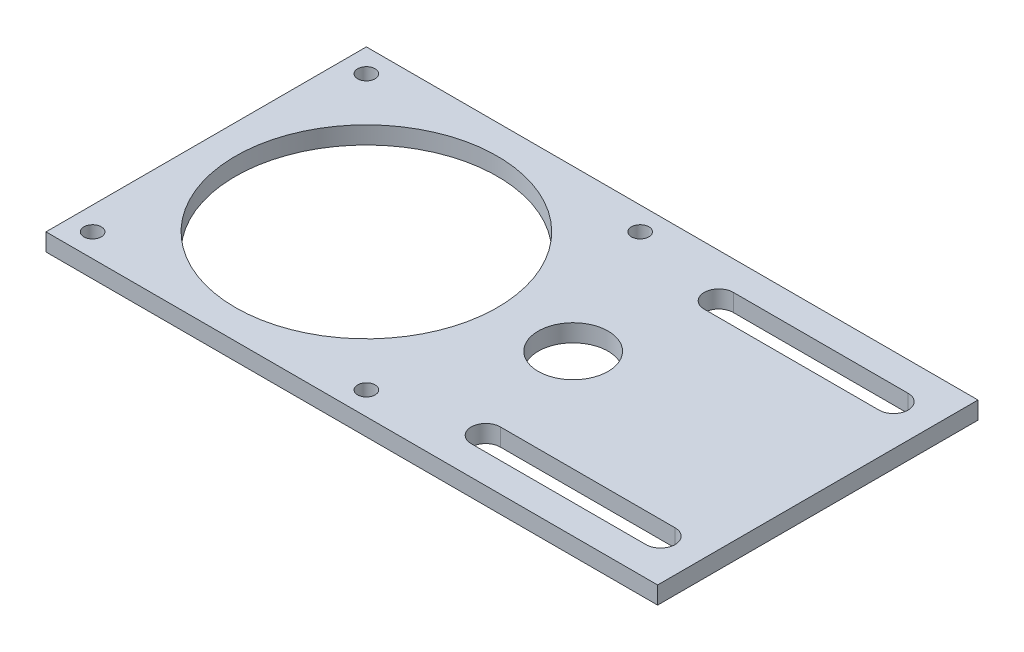
ISO-10303-21;
HEADER;
FILE_DESCRIPTION(('STEP AP214'),'2;1');
FILE_NAME('part.step','',(''),(''),'','','');
FILE_SCHEMA(('AUTOMOTIVE_DESIGN { 1 0 10303 214 1 1 1 1 }'));
ENDSEC;
DATA;
#1=APPLICATION_CONTEXT('core data for automotive mechanical design processes');
#2=APPLICATION_PROTOCOL_DEFINITION('international standard','automotive_design',2000,#1);
#3=PRODUCT_CONTEXT('',#1,'mechanical');
#4=PRODUCT('Part','Part','',(#3));
#5=PRODUCT_RELATED_PRODUCT_CATEGORY('part','',(#4));
#6=PRODUCT_DEFINITION_FORMATION('','',#4);
#7=PRODUCT_DEFINITION_CONTEXT('part definition',#1,'design');
#8=PRODUCT_DEFINITION('design','',#6,#7);
#9=PRODUCT_DEFINITION_SHAPE('','',#8);
#10=(LENGTH_UNIT() NAMED_UNIT(*) SI_UNIT(.MILLI.,.METRE.));
#11=(NAMED_UNIT(*) PLANE_ANGLE_UNIT() SI_UNIT($,.RADIAN.));
#12=(NAMED_UNIT(*) SI_UNIT($,.STERADIAN.) SOLID_ANGLE_UNIT());
#13=UNCERTAINTY_MEASURE_WITH_UNIT(LENGTH_MEASURE(1.E-05),#10,'distance_accuracy_value','');
#14=(GEOMETRIC_REPRESENTATION_CONTEXT(3) GLOBAL_UNCERTAINTY_ASSIGNED_CONTEXT((#13)) GLOBAL_UNIT_ASSIGNED_CONTEXT((#10,
#11,#12)) REPRESENTATION_CONTEXT('',''));
#15=CARTESIAN_POINT('',(0.,0.,0.));
#16=DIRECTION('',(0.,0.,1.));
#17=DIRECTION('',(1.,0.,0.));
#18=AXIS2_PLACEMENT_3D('',#15,#16,#17);
#19=CARTESIAN_POINT('',(0.,3.,0.));
#20=DIRECTION('',(0.,-1.,0.));
#21=DIRECTION('',(0.,0.,-1.));
#22=AXIS2_PLACEMENT_3D('',#19,#20,#21);
#23=PLANE('',#22);
#24=CARTESIAN_POINT('',(98.,3.,-47.5));
#25=DIRECTION('',(0.,1.,0.));
#26=DIRECTION('',(0.,0.,1.));
#27=AXIS2_PLACEMENT_3D('',#24,#25,#26);
#28=CIRCLE('',#27,2.50000000000001);
#29=CARTESIAN_POINT('',(98.,3.,-45.));
#30=VERTEX_POINT('',#29);
#31=CARTESIAN_POINT('',(98.,3.,-50.));
#32=VERTEX_POINT('',#31);
#33=EDGE_CURVE('E180',#30,#32,#28,.T.);
#34=ORIENTED_EDGE('',*,*,#33,.F.);
#35=DIRECTION('',(1.,0.,0.));
#36=VECTOR('',#35,1.);
#37=CARTESIAN_POINT('',(98.,3.,-45.));
#38=LINE('',#37,#36);
#39=CARTESIAN_POINT('',(68.,3.,-45.));
#40=VERTEX_POINT('',#39);
#41=EDGE_CURVE('E191',#40,#30,#38,.T.);
#42=ORIENTED_EDGE('',*,*,#41,.F.);
#43=CARTESIAN_POINT('',(68.,3.,-47.5));
#44=DIRECTION('',(0.,1.,0.));
#45=DIRECTION('',(0.,0.,1.));
#46=AXIS2_PLACEMENT_3D('',#43,#44,#45);
#47=CIRCLE('',#46,2.50000000000001);
#48=CARTESIAN_POINT('',(68.,3.,-50.));
#49=VERTEX_POINT('',#48);
#50=EDGE_CURVE('E187',#49,#40,#47,.T.);
#51=ORIENTED_EDGE('',*,*,#50,.F.);
#52=DIRECTION('',(-1.,0.,0.));
#53=VECTOR('',#52,1.);
#54=CARTESIAN_POINT('',(98.,3.,-50.));
#55=LINE('',#54,#53);
#56=EDGE_CURVE('E183',#32,#49,#55,.T.);
#57=ORIENTED_EDGE('',*,*,#56,.F.);
#58=EDGE_LOOP('',(#34,#42,#51,#57));
#59=FACE_BOUND('',#58,.T.);
#60=DIRECTION('',(0.,0.,1.));
#61=VECTOR('',#60,1.);
#62=CARTESIAN_POINT('',(0.,3.,0.));
#63=LINE('',#62,#61);
#64=CARTESIAN_POINT('',(0.,3.,-55.));
#65=VERTEX_POINT('',#64);
#66=CARTESIAN_POINT('',(0.,3.,0.));
#67=VERTEX_POINT('',#66);
#68=EDGE_CURVE('E231',#65,#67,#63,.T.);
#69=ORIENTED_EDGE('',*,*,#68,.T.);
#70=DIRECTION('',(1.,0.,0.));
#71=VECTOR('',#70,1.);
#72=CARTESIAN_POINT('',(0.,3.,0.));
#73=LINE('',#72,#71);
#74=CARTESIAN_POINT('',(105.,3.,0.));
#75=VERTEX_POINT('',#74);
#76=EDGE_CURVE('E235',#67,#75,#73,.T.);
#77=ORIENTED_EDGE('',*,*,#76,.T.);
#78=DIRECTION('',(0.,0.,-1.));
#79=VECTOR('',#78,1.);
#80=CARTESIAN_POINT('',(105.,3.,0.));
#81=LINE('',#80,#79);
#82=CARTESIAN_POINT('',(105.,3.,-55.));
#83=VERTEX_POINT('',#82);
#84=EDGE_CURVE('E239',#75,#83,#81,.T.);
#85=ORIENTED_EDGE('',*,*,#84,.T.);
#86=DIRECTION('',(-1.,0.,0.));
#87=VECTOR('',#86,1.);
#88=CARTESIAN_POINT('',(0.,3.,-55.));
#89=LINE('',#88,#87);
#90=EDGE_CURVE('E242',#83,#65,#89,.T.);
#91=ORIENTED_EDGE('',*,*,#90,.T.);
#92=EDGE_LOOP('',(#69,#77,#85,#91));
#93=FACE_BOUND('',#92,.T.);
#94=CARTESIAN_POINT('',(27.5,3.,-27.5));
#95=DIRECTION('',(0.,1.,0.));
#96=DIRECTION('',(0.,0.,1.));
#97=AXIS2_PLACEMENT_3D('',#94,#95,#96);
#98=CIRCLE('',#97,22.5);
#99=CARTESIAN_POINT('',(27.5,3.,-5.));
#100=VERTEX_POINT('',#99);
#101=EDGE_CURVE('E223',#100,#100,#98,.T.);
#102=ORIENTED_EDGE('',*,*,#101,.F.);
#103=EDGE_LOOP('',(#102));
#104=FACE_BOUND('',#103,.T.);
#105=CARTESIAN_POINT('',(98.0000000000004,3.,-7.50000000000001));
#106=DIRECTION('',(0.,1.,0.));
#107=DIRECTION('',(0.,0.,1.));
#108=AXIS2_PLACEMENT_3D('',#105,#106,#107);
#109=CIRCLE('',#108,2.50000000000001);
#110=CARTESIAN_POINT('',(98.0000000000004,3.,-5.));
#111=VERTEX_POINT('',#110);
#112=CARTESIAN_POINT('',(98.0000000000004,3.,-10.));
#113=VERTEX_POINT('',#112);
#114=EDGE_CURVE('E129',#111,#113,#109,.T.);
#115=ORIENTED_EDGE('',*,*,#114,.F.);
#116=DIRECTION('',(1.,0.,0.));
#117=VECTOR('',#116,1.);
#118=CARTESIAN_POINT('',(98.0000000000004,3.,-5.));
#119=LINE('',#118,#117);
#120=CARTESIAN_POINT('',(68.0000000000004,3.,-5.));
#121=VERTEX_POINT('',#120);
#122=EDGE_CURVE('E156',#121,#111,#119,.T.);
#123=ORIENTED_EDGE('',*,*,#122,.F.);
#124=CARTESIAN_POINT('',(68.0000000000004,3.,-7.5));
#125=DIRECTION('',(0.,1.,0.));
#126=DIRECTION('',(0.,0.,1.));
#127=AXIS2_PLACEMENT_3D('',#124,#125,#126);
#128=CIRCLE('',#127,2.50000000000001);
#129=CARTESIAN_POINT('',(68.0000000000004,3.,-10.));
#130=VERTEX_POINT('',#129);
#131=EDGE_CURVE('E152',#130,#121,#128,.T.);
#132=ORIENTED_EDGE('',*,*,#131,.F.);
#133=DIRECTION('',(-1.,0.,0.));
#134=VECTOR('',#133,1.);
#135=CARTESIAN_POINT('',(98.0000000000004,3.,-10.));
#136=LINE('',#135,#134);
#137=EDGE_CURVE('E138',#113,#130,#136,.T.);
#138=ORIENTED_EDGE('',*,*,#137,.F.);
#139=EDGE_LOOP('',(#115,#123,#132,#138));
#140=FACE_BOUND('',#139,.T.);
#141=CARTESIAN_POINT('',(63.,3.,-27.5));
#142=DIRECTION('',(0.,1.,0.));
#143=DIRECTION('',(0.,0.,1.));
#144=AXIS2_PLACEMENT_3D('',#141,#142,#143);
#145=CIRCLE('',#144,6.);
#146=CARTESIAN_POINT('',(63.,3.,-21.5));
#147=VERTEX_POINT('',#146);
#148=EDGE_CURVE('E164',#147,#147,#145,.T.);
#149=ORIENTED_EDGE('',*,*,#148,.F.);
#150=EDGE_LOOP('',(#149));
#151=FACE_BOUND('',#150,.T.);
#152=CARTESIAN_POINT('',(4.,3.,-4.));
#153=DIRECTION('',(0.,1.,0.));
#154=DIRECTION('',(0.,0.,1.));
#155=AXIS2_PLACEMENT_3D('',#152,#153,#154);
#156=CIRCLE('',#155,1.5);
#157=CARTESIAN_POINT('',(4.,3.,-2.5));
#158=VERTEX_POINT('',#157);
#159=EDGE_CURVE('E397',#158,#158,#156,.T.);
#160=ORIENTED_EDGE('',*,*,#159,.F.);
#161=EDGE_LOOP('',(#160));
#162=FACE_BOUND('',#161,.T.);
#163=CARTESIAN_POINT('',(51.,3.,-4.));
#164=DIRECTION('',(0.,1.,0.));
#165=DIRECTION('',(0.,0.,1.));
#166=AXIS2_PLACEMENT_3D('',#163,#164,#165);
#167=CIRCLE('',#166,1.5);
#168=CARTESIAN_POINT('',(51.,3.,-2.5));
#169=VERTEX_POINT('',#168);
#170=EDGE_CURVE('E389',#169,#169,#167,.T.);
#171=ORIENTED_EDGE('',*,*,#170,.F.);
#172=EDGE_LOOP('',(#171));
#173=FACE_BOUND('',#172,.T.);
#174=CARTESIAN_POINT('',(50.9999999999998,3.,-51.));
#175=DIRECTION('',(0.,1.,0.));
#176=DIRECTION('',(0.,0.,1.));
#177=AXIS2_PLACEMENT_3D('',#174,#175,#176);
#178=CIRCLE('',#177,1.5);
#179=CARTESIAN_POINT('',(50.9999999999998,3.,-49.5));
#180=VERTEX_POINT('',#179);
#181=EDGE_CURVE('E381',#180,#180,#178,.T.);
#182=ORIENTED_EDGE('',*,*,#181,.F.);
#183=EDGE_LOOP('',(#182));
#184=FACE_BOUND('',#183,.T.);
#185=CARTESIAN_POINT('',(3.99999999999984,3.,-51.));
#186=DIRECTION('',(0.,1.,0.));
#187=DIRECTION('',(0.,0.,1.));
#188=AXIS2_PLACEMENT_3D('',#185,#186,#187);
#189=CIRCLE('',#188,1.5);
#190=CARTESIAN_POINT('',(3.99999999999984,3.,-49.5));
#191=VERTEX_POINT('',#190);
#192=EDGE_CURVE('E370',#191,#191,#189,.T.);
#193=ORIENTED_EDGE('',*,*,#192,.F.);
#194=EDGE_LOOP('',(#193));
#195=FACE_BOUND('',#194,.T.);
#196=ADVANCED_FACE('F39',(#59,#93,#104,#140,#151,#162,#173,#184,#195),#23,.F.);
#197=CARTESIAN_POINT('',(0.,0.,0.));
#198=DIRECTION('',(0.,-1.,0.));
#199=DIRECTION('',(0.,0.,-1.));
#200=AXIS2_PLACEMENT_3D('',#197,#198,#199);
#201=PLANE('',#200);
#202=CARTESIAN_POINT('',(50.9999999999998,0.,-51.));
#203=DIRECTION('',(0.,1.,0.));
#204=DIRECTION('',(0.,0.,1.));
#205=AXIS2_PLACEMENT_3D('',#202,#203,#204);
#206=CIRCLE('',#205,1.5);
#207=CARTESIAN_POINT('',(50.9999999999998,0.,-49.5));
#208=VERTEX_POINT('',#207);
#209=EDGE_CURVE('E378',#208,#208,#206,.T.);
#210=ORIENTED_EDGE('',*,*,#209,.T.);
#211=EDGE_LOOP('',(#210));
#212=FACE_BOUND('',#211,.T.);
#213=CARTESIAN_POINT('',(4.,0.,-4.));
#214=DIRECTION('',(0.,1.,0.));
#215=DIRECTION('',(0.,0.,1.));
#216=AXIS2_PLACEMENT_3D('',#213,#214,#215);
#217=CIRCLE('',#216,1.5);
#218=CARTESIAN_POINT('',(4.,0.,-2.5));
#219=VERTEX_POINT('',#218);
#220=EDGE_CURVE('E393',#219,#219,#217,.T.);
#221=ORIENTED_EDGE('',*,*,#220,.T.);
#222=EDGE_LOOP('',(#221));
#223=FACE_BOUND('',#222,.T.);
#224=DIRECTION('',(1.,0.,0.));
#225=VECTOR('',#224,1.);
#226=CARTESIAN_POINT('',(98.0000000000004,0.,-5.));
#227=LINE('',#226,#225);
#228=CARTESIAN_POINT('',(68.0000000000004,0.,-5.));
#229=VERTEX_POINT('',#228);
#230=CARTESIAN_POINT('',(98.0000000000004,0.,-5.));
#231=VERTEX_POINT('',#230);
#232=EDGE_CURVE('E139',#229,#231,#227,.T.);
#233=ORIENTED_EDGE('',*,*,#232,.T.);
#234=CARTESIAN_POINT('',(98.0000000000004,0.,-7.50000000000001));
#235=DIRECTION('',(0.,1.,0.));
#236=DIRECTION('',(0.,0.,1.));
#237=AXIS2_PLACEMENT_3D('',#234,#235,#236);
#238=CIRCLE('',#237,2.50000000000001);
#239=CARTESIAN_POINT('',(98.0000000000004,0.,-10.));
#240=VERTEX_POINT('',#239);
#241=EDGE_CURVE('E63',#231,#240,#238,.T.);
#242=ORIENTED_EDGE('',*,*,#241,.T.);
#243=DIRECTION('',(-1.,0.,0.));
#244=VECTOR('',#243,1.);
#245=CARTESIAN_POINT('',(98.0000000000004,0.,-10.));
#246=LINE('',#245,#244);
#247=CARTESIAN_POINT('',(68.0000000000004,0.,-10.));
#248=VERTEX_POINT('',#247);
#249=EDGE_CURVE('E145',#240,#248,#246,.T.);
#250=ORIENTED_EDGE('',*,*,#249,.T.);
#251=CARTESIAN_POINT('',(68.0000000000004,0.,-7.5));
#252=DIRECTION('',(0.,1.,0.));
#253=DIRECTION('',(0.,0.,1.));
#254=AXIS2_PLACEMENT_3D('',#251,#252,#253);
#255=CIRCLE('',#254,2.50000000000001);
#256=EDGE_CURVE('E167',#248,#229,#255,.T.);
#257=ORIENTED_EDGE('',*,*,#256,.T.);
#258=EDGE_LOOP('',(#233,#242,#250,#257));
#259=FACE_BOUND('',#258,.T.);
#260=DIRECTION('',(1.,0.,0.));
#261=VECTOR('',#260,1.);
#262=CARTESIAN_POINT('',(98.,0.,-45.));
#263=LINE('',#262,#261);
#264=CARTESIAN_POINT('',(68.,0.,-45.));
#265=VERTEX_POINT('',#264);
#266=CARTESIAN_POINT('',(98.,0.,-45.));
#267=VERTEX_POINT('',#266);
#268=EDGE_CURVE('E184',#265,#267,#263,.T.);
#269=ORIENTED_EDGE('',*,*,#268,.T.);
#270=CARTESIAN_POINT('',(98.,0.,-47.5));
#271=DIRECTION('',(0.,1.,0.));
#272=DIRECTION('',(0.,0.,1.));
#273=AXIS2_PLACEMENT_3D('',#270,#271,#272);
#274=CIRCLE('',#273,2.50000000000001);
#275=CARTESIAN_POINT('',(98.,0.,-50.));
#276=VERTEX_POINT('',#275);
#277=EDGE_CURVE('E147',#267,#276,#274,.T.);
#278=ORIENTED_EDGE('',*,*,#277,.T.);
#279=DIRECTION('',(-1.,0.,0.));
#280=VECTOR('',#279,1.);
#281=CARTESIAN_POINT('',(98.,0.,-50.));
#282=LINE('',#281,#280);
#283=CARTESIAN_POINT('',(68.,0.,-50.));
#284=VERTEX_POINT('',#283);
#285=EDGE_CURVE('E198',#276,#284,#282,.T.);
#286=ORIENTED_EDGE('',*,*,#285,.T.);
#287=CARTESIAN_POINT('',(68.,0.,-47.5));
#288=DIRECTION('',(0.,1.,0.));
#289=DIRECTION('',(0.,0.,1.));
#290=AXIS2_PLACEMENT_3D('',#287,#288,#289);
#291=CIRCLE('',#290,2.50000000000001);
#292=EDGE_CURVE('E202',#284,#265,#291,.T.);
#293=ORIENTED_EDGE('',*,*,#292,.T.);
#294=EDGE_LOOP('',(#269,#278,#286,#293));
#295=FACE_BOUND('',#294,.T.);
#296=CARTESIAN_POINT('',(27.5,0.,-27.5));
#297=DIRECTION('',(0.,1.,0.));
#298=DIRECTION('',(0.,0.,1.));
#299=AXIS2_PLACEMENT_3D('',#296,#297,#298);
#300=CIRCLE('',#299,22.5);
#301=CARTESIAN_POINT('',(27.5,0.,-5.));
#302=VERTEX_POINT('',#301);
#303=EDGE_CURVE('E222',#302,#302,#300,.T.);
#304=ORIENTED_EDGE('',*,*,#303,.T.);
#305=EDGE_LOOP('',(#304));
#306=FACE_BOUND('',#305,.T.);
#307=DIRECTION('',(0.,0.,1.));
#308=VECTOR('',#307,1.);
#309=CARTESIAN_POINT('',(0.,0.,0.));
#310=LINE('',#309,#308);
#311=CARTESIAN_POINT('',(0.,0.,-55.));
#312=VERTEX_POINT('',#311);
#313=CARTESIAN_POINT('',(0.,0.,0.));
#314=VERTEX_POINT('',#313);
#315=EDGE_CURVE('E227',#312,#314,#310,.T.);
#316=ORIENTED_EDGE('',*,*,#315,.F.);
#317=DIRECTION('',(-1.,0.,0.));
#318=VECTOR('',#317,1.);
#319=CARTESIAN_POINT('',(0.,0.,-55.));
#320=LINE('',#319,#318);
#321=CARTESIAN_POINT('',(105.,0.,-55.));
#322=VERTEX_POINT('',#321);
#323=EDGE_CURVE('E236',#322,#312,#320,.T.);
#324=ORIENTED_EDGE('',*,*,#323,.F.);
#325=DIRECTION('',(0.,0.,-1.));
#326=VECTOR('',#325,1.);
#327=CARTESIAN_POINT('',(105.,0.,0.));
#328=LINE('',#327,#326);
#329=CARTESIAN_POINT('',(105.,0.,0.));
#330=VERTEX_POINT('',#329);
#331=EDGE_CURVE('E252',#330,#322,#328,.T.);
#332=ORIENTED_EDGE('',*,*,#331,.F.);
#333=DIRECTION('',(1.,0.,0.));
#334=VECTOR('',#333,1.);
#335=CARTESIAN_POINT('',(0.,0.,0.));
#336=LINE('',#335,#334);
#337=EDGE_CURVE('E249',#314,#330,#336,.T.);
#338=ORIENTED_EDGE('',*,*,#337,.F.);
#339=EDGE_LOOP('',(#316,#324,#332,#338));
#340=FACE_BOUND('',#339,.T.);
#341=CARTESIAN_POINT('',(63.,0.,-27.5));
#342=DIRECTION('',(0.,1.,0.));
#343=DIRECTION('',(0.,0.,1.));
#344=AXIS2_PLACEMENT_3D('',#341,#342,#343);
#345=CIRCLE('',#344,6.);
#346=CARTESIAN_POINT('',(63.,0.,-21.5));
#347=VERTEX_POINT('',#346);
#348=EDGE_CURVE('E401',#347,#347,#345,.T.);
#349=ORIENTED_EDGE('',*,*,#348,.T.);
#350=EDGE_LOOP('',(#349));
#351=FACE_BOUND('',#350,.T.);
#352=CARTESIAN_POINT('',(51.,0.,-4.));
#353=DIRECTION('',(0.,1.,0.));
#354=DIRECTION('',(0.,0.,1.));
#355=AXIS2_PLACEMENT_3D('',#352,#353,#354);
#356=CIRCLE('',#355,1.5);
#357=CARTESIAN_POINT('',(51.,0.,-2.5));
#358=VERTEX_POINT('',#357);
#359=EDGE_CURVE('E385',#358,#358,#356,.T.);
#360=ORIENTED_EDGE('',*,*,#359,.T.);
#361=EDGE_LOOP('',(#360));
#362=FACE_BOUND('',#361,.T.);
#363=CARTESIAN_POINT('',(3.99999999999984,0.,-51.));
#364=DIRECTION('',(0.,1.,0.));
#365=DIRECTION('',(0.,0.,1.));
#366=AXIS2_PLACEMENT_3D('',#363,#364,#365);
#367=CIRCLE('',#366,1.5);
#368=CARTESIAN_POINT('',(3.99999999999984,0.,-49.5));
#369=VERTEX_POINT('',#368);
#370=EDGE_CURVE('E373',#369,#369,#367,.T.);
#371=ORIENTED_EDGE('',*,*,#370,.T.);
#372=EDGE_LOOP('',(#371));
#373=FACE_BOUND('',#372,.T.);
#374=ADVANCED_FACE('F275',(#212,#223,#259,#295,#306,#340,#351,#362,#373),#201,.T.);
#375=CARTESIAN_POINT('',(0.,3.,0.));
#376=DIRECTION('',(1.,0.,0.));
#377=DIRECTION('',(0.,0.,-1.));
#378=AXIS2_PLACEMENT_3D('',#375,#376,#377);
#379=PLANE('',#378);
#380=ORIENTED_EDGE('',*,*,#315,.T.);
#381=DIRECTION('',(0.,-1.,0.));
#382=VECTOR('',#381,1.);
#383=CARTESIAN_POINT('',(0.,3.,0.));
#384=LINE('',#383,#382);
#385=EDGE_CURVE('E11',#67,#314,#384,.T.);
#386=ORIENTED_EDGE('',*,*,#385,.F.);
#387=ORIENTED_EDGE('',*,*,#68,.F.);
#388=DIRECTION('',(0.,-1.,0.));
#389=VECTOR('',#388,1.);
#390=CARTESIAN_POINT('',(0.,3.,-55.));
#391=LINE('',#390,#389);
#392=EDGE_CURVE('E245',#65,#312,#391,.T.);
#393=ORIENTED_EDGE('',*,*,#392,.T.);
#394=EDGE_LOOP('',(#380,#386,#387,#393));
#395=FACE_BOUND('',#394,.T.);
#396=ADVANCED_FACE('F41',(#395),#379,.F.);
#397=CARTESIAN_POINT('',(0.,3.,0.));
#398=DIRECTION('',(0.,0.,-1.));
#399=DIRECTION('',(-1.,0.,0.));
#400=AXIS2_PLACEMENT_3D('',#397,#398,#399);
#401=PLANE('',#400);
#402=ORIENTED_EDGE('',*,*,#337,.T.);
#403=DIRECTION('',(0.,-1.,0.));
#404=VECTOR('',#403,1.);
#405=CARTESIAN_POINT('',(105.,3.,0.));
#406=LINE('',#405,#404);
#407=EDGE_CURVE('E48',#75,#330,#406,.T.);
#408=ORIENTED_EDGE('',*,*,#407,.F.);
#409=ORIENTED_EDGE('',*,*,#76,.F.);
#410=ORIENTED_EDGE('',*,*,#385,.T.);
#411=EDGE_LOOP('',(#402,#408,#409,#410));
#412=FACE_BOUND('',#411,.T.);
#413=ADVANCED_FACE('F286',(#412),#401,.F.);
#414=CARTESIAN_POINT('',(105.,3.,0.));
#415=DIRECTION('',(-1.,0.,0.));
#416=DIRECTION('',(0.,0.,1.));
#417=AXIS2_PLACEMENT_3D('',#414,#415,#416);
#418=PLANE('',#417);
#419=ORIENTED_EDGE('',*,*,#331,.T.);
#420=DIRECTION('',(0.,-1.,0.));
#421=VECTOR('',#420,1.);
#422=CARTESIAN_POINT('',(105.,3.,-55.));
#423=LINE('',#422,#421);
#424=EDGE_CURVE('E260',#83,#322,#423,.T.);
#425=ORIENTED_EDGE('',*,*,#424,.F.);
#426=ORIENTED_EDGE('',*,*,#84,.F.);
#427=ORIENTED_EDGE('',*,*,#407,.T.);
#428=EDGE_LOOP('',(#419,#425,#426,#427));
#429=FACE_BOUND('',#428,.T.);
#430=ADVANCED_FACE('F269',(#429),#418,.F.);
#431=CARTESIAN_POINT('',(0.,3.,-55.));
#432=DIRECTION('',(0.,0.,1.));
#433=DIRECTION('',(1.,0.,0.));
#434=AXIS2_PLACEMENT_3D('',#431,#432,#433);
#435=PLANE('',#434);
#436=ORIENTED_EDGE('',*,*,#323,.T.);
#437=ORIENTED_EDGE('',*,*,#392,.F.);
#438=ORIENTED_EDGE('',*,*,#90,.F.);
#439=ORIENTED_EDGE('',*,*,#424,.T.);
#440=EDGE_LOOP('',(#436,#437,#438,#439));
#441=FACE_BOUND('',#440,.T.);
#442=ADVANCED_FACE('F279',(#441),#435,.F.);
#443=CARTESIAN_POINT('',(27.5,3.,-27.5));
#444=DIRECTION('',(0.,-1.,0.));
#445=DIRECTION('',(0.,0.,-1.));
#446=AXIS2_PLACEMENT_3D('',#443,#444,#445);
#447=CYLINDRICAL_SURFACE('',#446,22.5);
#448=ORIENTED_EDGE('',*,*,#101,.T.);
#449=EDGE_LOOP('',(#448));
#450=FACE_BOUND('',#449,.T.);
#451=ORIENTED_EDGE('',*,*,#303,.F.);
#452=EDGE_LOOP('',(#451));
#453=FACE_BOUND('',#452,.T.);
#454=ADVANCED_FACE('F303',(#450,#453),#447,.F.);
#455=CARTESIAN_POINT('',(98.,3.,-47.5));
#456=DIRECTION('',(0.,-1.,0.));
#457=DIRECTION('',(0.,0.,-1.));
#458=AXIS2_PLACEMENT_3D('',#455,#456,#457);
#459=CYLINDRICAL_SURFACE('',#458,2.50000000000001);
#460=ORIENTED_EDGE('',*,*,#277,.F.);
#461=DIRECTION('',(0.,-1.,0.));
#462=VECTOR('',#461,1.);
#463=CARTESIAN_POINT('',(98.,3.,-45.));
#464=LINE('',#463,#462);
#465=EDGE_CURVE('E194',#30,#267,#464,.T.);
#466=ORIENTED_EDGE('',*,*,#465,.F.);
#467=ORIENTED_EDGE('',*,*,#33,.T.);
#468=DIRECTION('',(0.,-1.,0.));
#469=VECTOR('',#468,1.);
#470=CARTESIAN_POINT('',(98.,3.,-50.));
#471=LINE('',#470,#469);
#472=EDGE_CURVE('E218',#32,#276,#471,.T.);
#473=ORIENTED_EDGE('',*,*,#472,.T.);
#474=EDGE_LOOP('',(#460,#466,#467,#473));
#475=FACE_BOUND('',#474,.T.);
#476=ADVANCED_FACE('F310',(#475),#459,.F.);
#477=CARTESIAN_POINT('',(98.,3.,-50.));
#478=DIRECTION('',(0.,0.,1.));
#479=DIRECTION('',(1.,0.,0.));
#480=AXIS2_PLACEMENT_3D('',#477,#478,#479);
#481=PLANE('',#480);
#482=ORIENTED_EDGE('',*,*,#285,.F.);
#483=ORIENTED_EDGE('',*,*,#472,.F.);
#484=ORIENTED_EDGE('',*,*,#56,.T.);
#485=DIRECTION('',(0.,-1.,0.));
#486=VECTOR('',#485,1.);
#487=CARTESIAN_POINT('',(68.,3.,-50.));
#488=LINE('',#487,#486);
#489=EDGE_CURVE('E215',#49,#284,#488,.T.);
#490=ORIENTED_EDGE('',*,*,#489,.T.);
#491=EDGE_LOOP('',(#482,#483,#484,#490));
#492=FACE_BOUND('',#491,.T.);
#493=ADVANCED_FACE('F315',(#492),#481,.T.);
#494=CARTESIAN_POINT('',(68.,3.,-47.5));
#495=DIRECTION('',(0.,-1.,0.));
#496=DIRECTION('',(0.,0.,-1.));
#497=AXIS2_PLACEMENT_3D('',#494,#495,#496);
#498=CYLINDRICAL_SURFACE('',#497,2.50000000000001);
#499=ORIENTED_EDGE('',*,*,#292,.F.);
#500=ORIENTED_EDGE('',*,*,#489,.F.);
#501=ORIENTED_EDGE('',*,*,#50,.T.);
#502=DIRECTION('',(0.,-1.,0.));
#503=VECTOR('',#502,1.);
#504=CARTESIAN_POINT('',(68.,3.,-45.));
#505=LINE('',#504,#503);
#506=EDGE_CURVE('E212',#40,#265,#505,.T.);
#507=ORIENTED_EDGE('',*,*,#506,.T.);
#508=EDGE_LOOP('',(#499,#500,#501,#507));
#509=FACE_BOUND('',#508,.T.);
#510=ADVANCED_FACE('F324',(#509),#498,.F.);
#511=CARTESIAN_POINT('',(98.,3.,-45.));
#512=DIRECTION('',(0.,0.,-1.));
#513=DIRECTION('',(-1.,0.,0.));
#514=AXIS2_PLACEMENT_3D('',#511,#512,#513);
#515=PLANE('',#514);
#516=ORIENTED_EDGE('',*,*,#268,.F.);
#517=ORIENTED_EDGE('',*,*,#506,.F.);
#518=ORIENTED_EDGE('',*,*,#41,.T.);
#519=ORIENTED_EDGE('',*,*,#465,.T.);
#520=EDGE_LOOP('',(#516,#517,#518,#519));
#521=FACE_BOUND('',#520,.T.);
#522=ADVANCED_FACE('F330',(#521),#515,.T.);
#523=CARTESIAN_POINT('',(98.0000000000004,3.,-7.50000000000001));
#524=DIRECTION('',(0.,-1.,0.));
#525=DIRECTION('',(0.,0.,-1.));
#526=AXIS2_PLACEMENT_3D('',#523,#524,#525);
#527=CYLINDRICAL_SURFACE('',#526,2.50000000000001);
#528=ORIENTED_EDGE('',*,*,#241,.F.);
#529=DIRECTION('',(0.,-1.,0.));
#530=VECTOR('',#529,1.);
#531=CARTESIAN_POINT('',(98.0000000000004,3.,-5.));
#532=LINE('',#531,#530);
#533=EDGE_CURVE('E133',#111,#231,#532,.T.);
#534=ORIENTED_EDGE('',*,*,#533,.F.);
#535=ORIENTED_EDGE('',*,*,#114,.T.);
#536=DIRECTION('',(0.,-1.,0.));
#537=VECTOR('',#536,1.);
#538=CARTESIAN_POINT('',(98.0000000000004,3.,-10.));
#539=LINE('',#538,#537);
#540=EDGE_CURVE('E132',#113,#240,#539,.T.);
#541=ORIENTED_EDGE('',*,*,#540,.T.);
#542=EDGE_LOOP('',(#528,#534,#535,#541));
#543=FACE_BOUND('',#542,.T.);
#544=ADVANCED_FACE('F131',(#543),#527,.F.);
#545=CARTESIAN_POINT('',(98.0000000000004,3.,-10.));
#546=DIRECTION('',(0.,0.,1.));
#547=DIRECTION('',(1.,0.,0.));
#548=AXIS2_PLACEMENT_3D('',#545,#546,#547);
#549=PLANE('',#548);
#550=ORIENTED_EDGE('',*,*,#249,.F.);
#551=ORIENTED_EDGE('',*,*,#540,.F.);
#552=ORIENTED_EDGE('',*,*,#137,.T.);
#553=DIRECTION('',(0.,-1.,0.));
#554=VECTOR('',#553,1.);
#555=CARTESIAN_POINT('',(68.0000000000004,3.,-10.));
#556=LINE('',#555,#554);
#557=EDGE_CURVE('E148',#130,#248,#556,.T.);
#558=ORIENTED_EDGE('',*,*,#557,.T.);
#559=EDGE_LOOP('',(#550,#551,#552,#558));
#560=FACE_BOUND('',#559,.T.);
#561=ADVANCED_FACE('F142',(#560),#549,.T.);
#562=CARTESIAN_POINT('',(68.0000000000004,3.,-7.5));
#563=DIRECTION('',(0.,-1.,0.));
#564=DIRECTION('',(0.,0.,-1.));
#565=AXIS2_PLACEMENT_3D('',#562,#563,#564);
#566=CYLINDRICAL_SURFACE('',#565,2.50000000000001);
#567=ORIENTED_EDGE('',*,*,#256,.F.);
#568=ORIENTED_EDGE('',*,*,#557,.F.);
#569=ORIENTED_EDGE('',*,*,#131,.T.);
#570=DIRECTION('',(0.,-1.,0.));
#571=VECTOR('',#570,1.);
#572=CARTESIAN_POINT('',(68.0000000000004,3.,-5.));
#573=LINE('',#572,#571);
#574=EDGE_CURVE('E55',#121,#229,#573,.T.);
#575=ORIENTED_EDGE('',*,*,#574,.T.);
#576=EDGE_LOOP('',(#567,#568,#569,#575));
#577=FACE_BOUND('',#576,.T.);
#578=ADVANCED_FACE('F339',(#577),#566,.F.);
#579=CARTESIAN_POINT('',(98.0000000000004,3.,-5.));
#580=DIRECTION('',(0.,0.,-1.));
#581=DIRECTION('',(-1.,0.,0.));
#582=AXIS2_PLACEMENT_3D('',#579,#580,#581);
#583=PLANE('',#582);
#584=ORIENTED_EDGE('',*,*,#232,.F.);
#585=ORIENTED_EDGE('',*,*,#574,.F.);
#586=ORIENTED_EDGE('',*,*,#122,.T.);
#587=ORIENTED_EDGE('',*,*,#533,.T.);
#588=EDGE_LOOP('',(#584,#585,#586,#587));
#589=FACE_BOUND('',#588,.T.);
#590=ADVANCED_FACE('F342',(#589),#583,.T.);
#591=CARTESIAN_POINT('',(63.,3.,-27.5));
#592=DIRECTION('',(0.,-1.,0.));
#593=DIRECTION('',(0.,0.,-1.));
#594=AXIS2_PLACEMENT_3D('',#591,#592,#593);
#595=CYLINDRICAL_SURFACE('',#594,6.);
#596=ORIENTED_EDGE('',*,*,#148,.T.);
#597=EDGE_LOOP('',(#596));
#598=FACE_BOUND('',#597,.T.);
#599=ORIENTED_EDGE('',*,*,#348,.F.);
#600=EDGE_LOOP('',(#599));
#601=FACE_BOUND('',#600,.T.);
#602=ADVANCED_FACE('F346',(#598,#601),#595,.F.);
#603=CARTESIAN_POINT('',(4.,3.,-4.));
#604=DIRECTION('',(0.,-1.,0.));
#605=DIRECTION('',(0.,0.,-1.));
#606=AXIS2_PLACEMENT_3D('',#603,#604,#605);
#607=CYLINDRICAL_SURFACE('',#606,1.5);
#608=ORIENTED_EDGE('',*,*,#159,.T.);
#609=EDGE_LOOP('',(#608));
#610=FACE_BOUND('',#609,.T.);
#611=ORIENTED_EDGE('',*,*,#220,.F.);
#612=EDGE_LOOP('',(#611));
#613=FACE_BOUND('',#612,.T.);
#614=ADVANCED_FACE('F349',(#610,#613),#607,.F.);
#615=CARTESIAN_POINT('',(51.,3.,-4.));
#616=DIRECTION('',(0.,-1.,0.));
#617=DIRECTION('',(0.,0.,-1.));
#618=AXIS2_PLACEMENT_3D('',#615,#616,#617);
#619=CYLINDRICAL_SURFACE('',#618,1.5);
#620=ORIENTED_EDGE('',*,*,#170,.T.);
#621=EDGE_LOOP('',(#620));
#622=FACE_BOUND('',#621,.T.);
#623=ORIENTED_EDGE('',*,*,#359,.F.);
#624=EDGE_LOOP('',(#623));
#625=FACE_BOUND('',#624,.T.);
#626=ADVANCED_FACE('F353',(#622,#625),#619,.F.);
#627=CARTESIAN_POINT('',(50.9999999999998,3.,-51.));
#628=DIRECTION('',(0.,-1.,0.));
#629=DIRECTION('',(0.,0.,-1.));
#630=AXIS2_PLACEMENT_3D('',#627,#628,#629);
#631=CYLINDRICAL_SURFACE('',#630,1.5);
#632=ORIENTED_EDGE('',*,*,#181,.T.);
#633=EDGE_LOOP('',(#632));
#634=FACE_BOUND('',#633,.T.);
#635=ORIENTED_EDGE('',*,*,#209,.F.);
#636=EDGE_LOOP('',(#635));
#637=FACE_BOUND('',#636,.T.);
#638=ADVANCED_FACE('F357',(#634,#637),#631,.F.);
#639=CARTESIAN_POINT('',(3.99999999999984,3.,-51.));
#640=DIRECTION('',(0.,-1.,0.));
#641=DIRECTION('',(0.,0.,-1.));
#642=AXIS2_PLACEMENT_3D('',#639,#640,#641);
#643=CYLINDRICAL_SURFACE('',#642,1.5);
#644=ORIENTED_EDGE('',*,*,#192,.T.);
#645=EDGE_LOOP('',(#644));
#646=FACE_BOUND('',#645,.T.);
#647=ORIENTED_EDGE('',*,*,#370,.F.);
#648=EDGE_LOOP('',(#647));
#649=FACE_BOUND('',#648,.T.);
#650=ADVANCED_FACE('F361',(#646,#649),#643,.F.);
#651=CLOSED_SHELL('',(#196,#374,#396,#413,#430,#442,#454,#476,#493,#510,#522,#544,#561,#578,
#590,#602,#614,#626,#638,#650));
#652=MANIFOLD_SOLID_BREP('B2',#651);
#653=ADVANCED_BREP_SHAPE_REPRESENTATION('',(#18,#652),#14);
#654=SHAPE_DEFINITION_REPRESENTATION(#9,#653);
ENDSEC;
END-ISO-10303-21;
